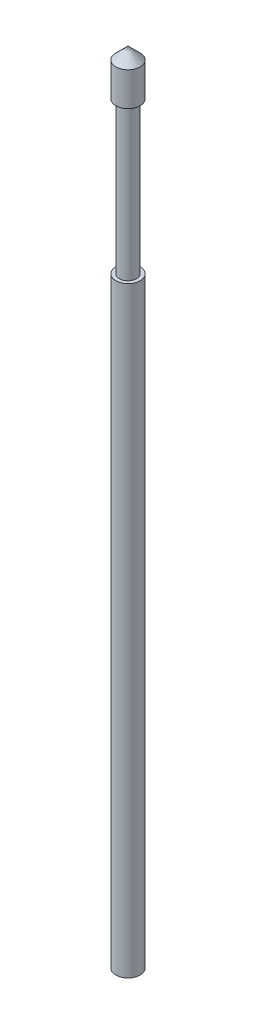
ISO-10303-21;
HEADER;
FILE_DESCRIPTION(('STEP AP214'),'2;1');
FILE_NAME('part.step','',(''),(''),'','','');
FILE_SCHEMA(('AUTOMOTIVE_DESIGN { 1 0 10303 214 1 1 1 1 }'));
ENDSEC;
DATA;
#1=APPLICATION_CONTEXT('core data for automotive mechanical design processes');
#2=APPLICATION_PROTOCOL_DEFINITION('international standard','automotive_design',2000,#1);
#3=PRODUCT_CONTEXT('',#1,'mechanical');
#4=PRODUCT('Part','Part','',(#3));
#5=PRODUCT_RELATED_PRODUCT_CATEGORY('part','',(#4));
#6=PRODUCT_DEFINITION_FORMATION('','',#4);
#7=PRODUCT_DEFINITION_CONTEXT('part definition',#1,'design');
#8=PRODUCT_DEFINITION('design','',#6,#7);
#9=PRODUCT_DEFINITION_SHAPE('','',#8);
#10=(LENGTH_UNIT() NAMED_UNIT(*) SI_UNIT(.MILLI.,.METRE.));
#11=(NAMED_UNIT(*) PLANE_ANGLE_UNIT() SI_UNIT($,.RADIAN.));
#12=(NAMED_UNIT(*) SI_UNIT($,.STERADIAN.) SOLID_ANGLE_UNIT());
#13=UNCERTAINTY_MEASURE_WITH_UNIT(LENGTH_MEASURE(1.E-05),#10,'distance_accuracy_value','');
#14=(GEOMETRIC_REPRESENTATION_CONTEXT(3) GLOBAL_UNCERTAINTY_ASSIGNED_CONTEXT((#13)) GLOBAL_UNIT_ASSIGNED_CONTEXT((#10,
#11,#12)) REPRESENTATION_CONTEXT('',''));
#15=CARTESIAN_POINT('',(0.,0.,0.));
#16=DIRECTION('',(0.,0.,1.));
#17=DIRECTION('',(1.,0.,0.));
#18=AXIS2_PLACEMENT_3D('',#15,#16,#17);
#19=CARTESIAN_POINT('',(0.,25.,0.));
#20=DIRECTION('',(0.,-1.,0.));
#21=DIRECTION('',(0.,0.,-1.));
#22=AXIS2_PLACEMENT_3D('',#19,#20,#21);
#23=CYLINDRICAL_SURFACE('',#22,0.505);
#24=CARTESIAN_POINT('',(0.,25.,0.));
#25=DIRECTION('',(0.,1.,0.));
#26=DIRECTION('',(0.,0.,1.));
#27=AXIS2_PLACEMENT_3D('',#24,#25,#26);
#28=CIRCLE('',#27,0.505);
#29=CARTESIAN_POINT('',(0.,25.,0.505));
#30=VERTEX_POINT('',#29);
#31=EDGE_CURVE('E39',#30,#30,#28,.T.);
#32=ORIENTED_EDGE('',*,*,#31,.F.);
#33=EDGE_LOOP('',(#32));
#34=FACE_BOUND('',#33,.T.);
#35=CARTESIAN_POINT('',(0.,0.,0.));
#36=DIRECTION('',(0.,1.,0.));
#37=DIRECTION('',(0.,0.,1.));
#38=AXIS2_PLACEMENT_3D('',#35,#36,#37);
#39=CIRCLE('',#38,0.505);
#40=CARTESIAN_POINT('',(0.,0.,0.505));
#41=VERTEX_POINT('',#40);
#42=EDGE_CURVE('E35',#41,#41,#39,.T.);
#43=ORIENTED_EDGE('',*,*,#42,.T.);
#44=EDGE_LOOP('',(#43));
#45=FACE_BOUND('',#44,.T.);
#46=ADVANCED_FACE('F32',(#34,#45),#23,.T.);
#47=CARTESIAN_POINT('',(0.,25.,0.));
#48=DIRECTION('',(0.,1.,0.));
#49=DIRECTION('',(0.,0.,1.));
#50=AXIS2_PLACEMENT_3D('',#47,#48,#49);
#51=PLANE('',#50);
#52=CARTESIAN_POINT('',(0.,25.,0.));
#53=DIRECTION('',(0.,1.,0.));
#54=DIRECTION('',(0.,0.,1.));
#55=AXIS2_PLACEMENT_3D('',#52,#53,#54);
#56=CIRCLE('',#55,0.36);
#57=CARTESIAN_POINT('',(0.,25.,0.36));
#58=VERTEX_POINT('',#57);
#59=EDGE_CURVE('E11',#58,#58,#56,.T.);
#60=ORIENTED_EDGE('',*,*,#59,.F.);
#61=EDGE_LOOP('',(#60));
#62=FACE_BOUND('',#61,.T.);
#63=ORIENTED_EDGE('',*,*,#31,.T.);
#64=EDGE_LOOP('',(#63));
#65=FACE_BOUND('',#64,.T.);
#66=ADVANCED_FACE('F69',(#62,#65),#51,.T.);
#67=CARTESIAN_POINT('',(0.,0.,0.));
#68=DIRECTION('',(0.,1.,0.));
#69=DIRECTION('',(0.,0.,1.));
#70=AXIS2_PLACEMENT_3D('',#67,#68,#69);
#71=PLANE('',#70);
#72=ORIENTED_EDGE('',*,*,#42,.F.);
#73=EDGE_LOOP('',(#72));
#74=FACE_BOUND('',#73,.T.);
#75=ADVANCED_FACE('F66',(#74),#71,.F.);
#76=CARTESIAN_POINT('',(0.,31.3,0.));
#77=DIRECTION('',(0.,-1.,0.));
#78=DIRECTION('',(0.,0.,-1.));
#79=AXIS2_PLACEMENT_3D('',#76,#77,#78);
#80=CYLINDRICAL_SURFACE('',#79,0.36);
#81=CARTESIAN_POINT('',(0.,31.3,0.));
#82=DIRECTION('',(0.,1.,0.));
#83=DIRECTION('',(0.,0.,1.));
#84=AXIS2_PLACEMENT_3D('',#81,#82,#83);
#85=CIRCLE('',#84,0.36);
#86=CARTESIAN_POINT('',(0.,31.3,0.36));
#87=VERTEX_POINT('',#86);
#88=EDGE_CURVE('E52',#87,#87,#85,.T.);
#89=ORIENTED_EDGE('',*,*,#88,.F.);
#90=EDGE_LOOP('',(#89));
#91=FACE_BOUND('',#90,.T.);
#92=ORIENTED_EDGE('',*,*,#59,.T.);
#93=EDGE_LOOP('',(#92));
#94=FACE_BOUND('',#93,.T.);
#95=ADVANCED_FACE('F68',(#91,#94),#80,.T.);
#96=CARTESIAN_POINT('',(0.,32.7,0.));
#97=DIRECTION('',(0.,-1.,0.));
#98=DIRECTION('',(0.,0.,-1.));
#99=AXIS2_PLACEMENT_3D('',#96,#97,#98);
#100=CYLINDRICAL_SURFACE('',#99,0.505);
#101=CARTESIAN_POINT('',(0.,32.7,0.));
#102=DIRECTION('',(0.,1.,0.));
#103=DIRECTION('',(0.,0.,1.));
#104=AXIS2_PLACEMENT_3D('',#101,#102,#103);
#105=CIRCLE('',#104,0.505);
#106=CARTESIAN_POINT('',(0.,32.7,0.505));
#107=VERTEX_POINT('',#106);
#108=EDGE_CURVE('E50',#107,#107,#105,.T.);
#109=ORIENTED_EDGE('',*,*,#108,.F.);
#110=EDGE_LOOP('',(#109));
#111=FACE_BOUND('',#110,.T.);
#112=CARTESIAN_POINT('',(0.,31.3,0.));
#113=DIRECTION('',(0.,1.,0.));
#114=DIRECTION('',(0.,0.,1.));
#115=AXIS2_PLACEMENT_3D('',#112,#113,#114);
#116=CIRCLE('',#115,0.505);
#117=CARTESIAN_POINT('',(0.,31.3,0.505));
#118=VERTEX_POINT('',#117);
#119=EDGE_CURVE('E53',#118,#118,#116,.T.);
#120=ORIENTED_EDGE('',*,*,#119,.T.);
#121=EDGE_LOOP('',(#120));
#122=FACE_BOUND('',#121,.T.);
#123=ADVANCED_FACE('F74',(#111,#122),#100,.T.);
#124=CARTESIAN_POINT('',(0.,31.3,0.));
#125=DIRECTION('',(0.,1.,0.));
#126=DIRECTION('',(0.,0.,1.));
#127=AXIS2_PLACEMENT_3D('',#124,#125,#126);
#128=PLANE('',#127);
#129=ORIENTED_EDGE('',*,*,#88,.T.);
#130=EDGE_LOOP('',(#129));
#131=FACE_BOUND('',#130,.T.);
#132=ORIENTED_EDGE('',*,*,#119,.F.);
#133=EDGE_LOOP('',(#132));
#134=FACE_BOUND('',#133,.T.);
#135=ADVANCED_FACE('F46',(#131,#134),#128,.F.);
#136=CARTESIAN_POINT('',(0.,32.7,0.));
#137=DIRECTION('',(0.,-1.,0.));
#138=DIRECTION('',(0.,0.,-1.));
#139=AXIS2_PLACEMENT_3D('',#136,#137,#138);
#140=CONICAL_SURFACE('',#139,0.505,0.790373246728302);
#141=CARTESIAN_POINT('',(0.,33.2,0.));
#142=VERTEX_POINT('',#141);
#143=VERTEX_LOOP('',#142);
#144=FACE_BOUND('',#143,.T.);
#145=ORIENTED_EDGE('',*,*,#108,.T.);
#146=EDGE_LOOP('',(#145));
#147=FACE_BOUND('',#146,.T.);
#148=ADVANCED_FACE('F43',(#144,#147),#140,.T.);
#149=CLOSED_SHELL('',(#46,#66,#75,#95,#123,#135,#148));
#150=MANIFOLD_SOLID_BREP('B2',#149);
#151=ADVANCED_BREP_SHAPE_REPRESENTATION('',(#18,#150),#14);
#152=SHAPE_DEFINITION_REPRESENTATION(#9,#151);
ENDSEC;
END-ISO-10303-21;
